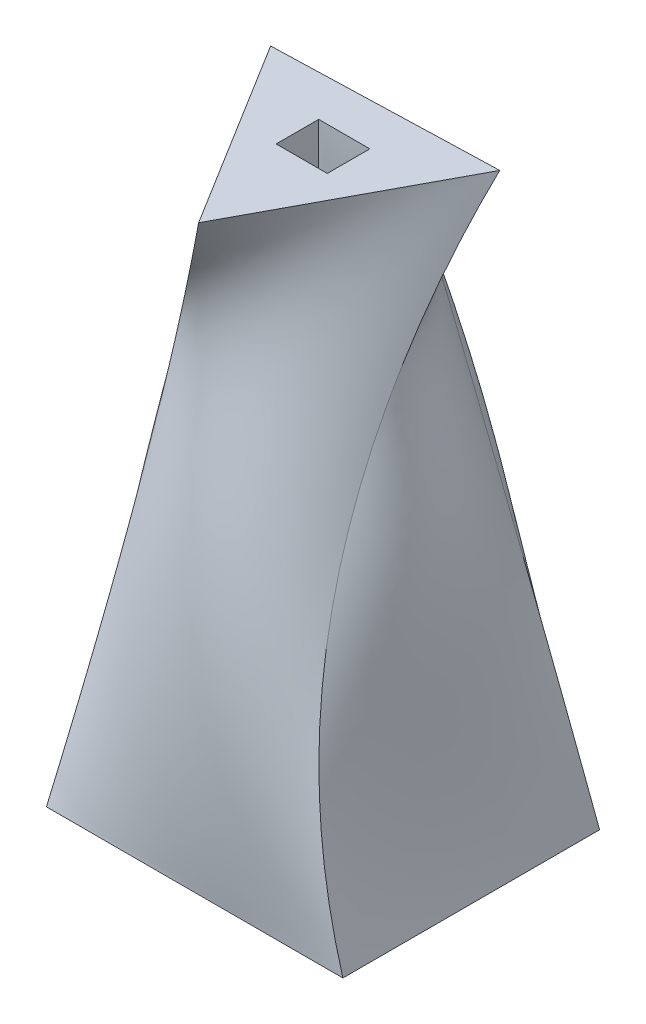
ISO-10303-21;
HEADER;
FILE_DESCRIPTION(('STEP AP214'),'2;1');
FILE_NAME('part.step','',(''),(''),'','','');
FILE_SCHEMA(('AUTOMOTIVE_DESIGN { 1 0 10303 214 1 1 1 1 }'));
ENDSEC;
DATA;
#1=APPLICATION_CONTEXT('core data for automotive mechanical design processes');
#2=APPLICATION_PROTOCOL_DEFINITION('international standard','automotive_design',2000,#1);
#3=PRODUCT_CONTEXT('',#1,'mechanical');
#4=PRODUCT('Part','Part','',(#3));
#5=PRODUCT_RELATED_PRODUCT_CATEGORY('part','',(#4));
#6=PRODUCT_DEFINITION_FORMATION('','',#4);
#7=PRODUCT_DEFINITION_CONTEXT('part definition',#1,'design');
#8=PRODUCT_DEFINITION('design','',#6,#7);
#9=PRODUCT_DEFINITION_SHAPE('','',#8);
#10=(LENGTH_UNIT() NAMED_UNIT(*) SI_UNIT(.MILLI.,.METRE.));
#11=(NAMED_UNIT(*) PLANE_ANGLE_UNIT() SI_UNIT($,.RADIAN.));
#12=(NAMED_UNIT(*) SI_UNIT($,.STERADIAN.) SOLID_ANGLE_UNIT());
#13=UNCERTAINTY_MEASURE_WITH_UNIT(LENGTH_MEASURE(1.E-05),#10,'distance_accuracy_value','');
#14=(GEOMETRIC_REPRESENTATION_CONTEXT(3) GLOBAL_UNCERTAINTY_ASSIGNED_CONTEXT((#13)) GLOBAL_UNIT_ASSIGNED_CONTEXT((#10,
#11,#12)) REPRESENTATION_CONTEXT('',''));
#15=CARTESIAN_POINT('',(0.,0.,0.));
#16=DIRECTION('',(0.,0.,1.));
#17=DIRECTION('',(1.,0.,0.));
#18=AXIS2_PLACEMENT_3D('',#15,#16,#17);
#19=CARTESIAN_POINT('',(0.,200.,0.));
#20=DIRECTION('',(0.,1.,0.));
#21=DIRECTION('',(0.,0.,1.));
#22=AXIS2_PLACEMENT_3D('',#19,#20,#21);
#23=PLANE('',#22);
#24=DIRECTION('',(0.,0.,1.));
#25=VECTOR('',#24,1.);
#26=CARTESIAN_POINT('',(-8.77945840094851,200.,-7.31956122791268));
#27=LINE('',#26,#25);
#28=CARTESIAN_POINT('',(-8.77945840094851,200.,-7.31956122791268));
#29=VERTEX_POINT('',#28);
#30=CARTESIAN_POINT('',(-8.77945840094851,200.,7.31956122791268));
#31=VERTEX_POINT('',#30);
#32=EDGE_CURVE('E330',#29,#31,#27,.T.);
#33=ORIENTED_EDGE('',*,*,#32,.F.);
#34=DIRECTION('',(-1.,0.,0.));
#35=VECTOR('',#34,1.);
#36=CARTESIAN_POINT('',(-8.77945840094851,200.,-7.31956122791268));
#37=LINE('',#36,#35);
#38=CARTESIAN_POINT('',(8.77945840094851,200.,-7.31956122791268));
#39=VERTEX_POINT('',#38);
#40=EDGE_CURVE('E349',#39,#29,#37,.T.);
#41=ORIENTED_EDGE('',*,*,#40,.F.);
#42=DIRECTION('',(0.,0.,-1.));
#43=VECTOR('',#42,1.);
#44=CARTESIAN_POINT('',(8.77945840094851,200.,-7.31956122791268));
#45=LINE('',#44,#43);
#46=CARTESIAN_POINT('',(8.77945840094851,200.,7.31956122791268));
#47=VERTEX_POINT('',#46);
#48=EDGE_CURVE('E310',#47,#39,#45,.T.);
#49=ORIENTED_EDGE('',*,*,#48,.F.);
#50=DIRECTION('',(1.,0.,0.));
#51=VECTOR('',#50,1.);
#52=CARTESIAN_POINT('',(-8.77945840094851,200.,7.31956122791268));
#53=LINE('',#52,#51);
#54=EDGE_CURVE('E145',#31,#47,#53,.T.);
#55=ORIENTED_EDGE('',*,*,#54,.F.);
#56=EDGE_LOOP('',(#33,#41,#49,#55));
#57=FACE_BOUND('',#56,.T.);
#58=DIRECTION('',(0.5263558856183,0.,0.850264359875783));
#59=VECTOR('',#58,1.);
#60=CARTESIAN_POINT('',(-38.88052542294,200.,-20.8828953071879));
#61=LINE('',#60,#59);
#62=CARTESIAN_POINT('',(-38.88052542294,200.,-20.8828953071879));
#63=VERTEX_POINT('',#62);
#64=CARTESIAN_POINT('',(1.35514487087436,200.,44.1129703823469));
#65=VERTEX_POINT('',#64);
#66=EDGE_CURVE('E531',#63,#65,#61,.T.);
#67=ORIENTED_EDGE('',*,*,#66,.T.);
#68=DIRECTION('',(0.47317259277579,0.,-0.880969748314796));
#69=VECTOR('',#68,1.);
#70=CARTESIAN_POINT('',(1.35514487087436,200.,44.1129703823469));
#71=LINE('',#70,#69);
#72=CARTESIAN_POINT('',(37.5253805520656,200.,-23.2300750751588));
#73=VERTEX_POINT('',#72);
#74=EDGE_CURVE('E544',#65,#73,#71,.T.);
#75=ORIENTED_EDGE('',*,*,#74,.T.);
#76=DIRECTION('',(-0.999528478394092,0.,0.030705388439015));
#77=VECTOR('',#76,1.);
#78=CARTESIAN_POINT('',(37.5253805520656,200.,-23.2300750751588));
#79=LINE('',#78,#77);
#80=CARTESIAN_POINT('',(2.06904509961198,200.,-22.1408609344664));
#81=VERTEX_POINT('',#80);
#82=EDGE_CURVE('E12',#73,#81,#79,.T.);
#83=ORIENTED_EDGE('',*,*,#82,.T.);
#84=EDGE_CURVE('E152',#81,#63,#79,.T.);
#85=ORIENTED_EDGE('',*,*,#84,.T.);
#86=EDGE_LOOP('',(#67,#75,#83,#85));
#87=FACE_BOUND('',#86,.T.);
#88=ADVANCED_FACE('F141',(#57,#87),#23,.T.);
#89=CARTESIAN_POINT('',(0.,0.,0.));
#90=DIRECTION('',(0.,1.,0.));
#91=DIRECTION('',(0.,0.,1.));
#92=AXIS2_PLACEMENT_3D('',#89,#90,#91);
#93=PLANE('',#92);
#94=CARTESIAN_POINT('',(0.,0.,0.));
#95=DIRECTION('',(0.,-1.,0.));
#96=DIRECTION('',(0.,0.,-1.));
#97=AXIS2_PLACEMENT_3D('',#94,#95,#96);
#98=CIRCLE('',#97,21.9489551883101);
#99=CARTESIAN_POINT('',(-16.8584942504055,0.,-14.0551700618486));
#100=VERTEX_POINT('',#99);
#101=CARTESIAN_POINT('',(16.8584942504055,0.,-14.0551700618486));
#102=VERTEX_POINT('',#101);
#103=EDGE_CURVE('E226',#100,#102,#98,.T.);
#104=ORIENTED_EDGE('',*,*,#103,.F.);
#105=CARTESIAN_POINT('',(-16.8584942504055,0.,14.0551700618487));
#106=VERTEX_POINT('',#105);
#107=EDGE_CURVE('E234',#106,#100,#98,.T.);
#108=ORIENTED_EDGE('',*,*,#107,.F.);
#109=CARTESIAN_POINT('',(16.8584942504055,0.,14.0551700618486));
#110=VERTEX_POINT('',#109);
#111=EDGE_CURVE('E209',#110,#106,#98,.T.);
#112=ORIENTED_EDGE('',*,*,#111,.F.);
#113=EDGE_CURVE('E219',#102,#110,#98,.T.);
#114=ORIENTED_EDGE('',*,*,#113,.F.);
#115=EDGE_LOOP('',(#104,#108,#112,#114));
#116=FACE_BOUND('',#115,.T.);
#117=DIRECTION('',(0.,0.,-1.));
#118=VECTOR('',#117,1.);
#119=CARTESIAN_POINT('',(50.9473742444007,0.,-44.1129703823469));
#120=LINE('',#119,#118);
#121=CARTESIAN_POINT('',(50.9473742444006,0.,44.1129703823469));
#122=VERTEX_POINT('',#121);
#123=CARTESIAN_POINT('',(50.9473742444007,0.,-44.1129703823469));
#124=VERTEX_POINT('',#123);
#125=EDGE_CURVE('E476',#122,#124,#120,.T.);
#126=ORIENTED_EDGE('',*,*,#125,.F.);
#127=DIRECTION('',(1.,0.,0.));
#128=VECTOR('',#127,1.);
#129=CARTESIAN_POINT('',(-50.9473742444007,0.,44.1129703823469));
#130=LINE('',#129,#128);
#131=CARTESIAN_POINT('',(-50.9473742444007,0.,44.1129703823469));
#132=VERTEX_POINT('',#131);
#133=EDGE_CURVE('E611',#132,#122,#130,.T.);
#134=ORIENTED_EDGE('',*,*,#133,.F.);
#135=DIRECTION('',(0.,0.,1.));
#136=VECTOR('',#135,1.);
#137=CARTESIAN_POINT('',(-50.9473742444007,0.,-44.1129703823469));
#138=LINE('',#137,#136);
#139=CARTESIAN_POINT('',(-50.9473742444007,0.,-44.1129703823469));
#140=VERTEX_POINT('',#139);
#141=EDGE_CURVE('E630',#140,#132,#138,.T.);
#142=ORIENTED_EDGE('',*,*,#141,.F.);
#143=DIRECTION('',(-1.,0.,0.));
#144=VECTOR('',#143,1.);
#145=CARTESIAN_POINT('',(-50.9473742444007,0.,-44.1129703823469));
#146=LINE('',#145,#144);
#147=EDGE_CURVE('E487',#124,#140,#146,.T.);
#148=ORIENTED_EDGE('',*,*,#147,.F.);
#149=EDGE_LOOP('',(#126,#134,#142,#148));
#150=FACE_BOUND('',#149,.T.);
#151=ADVANCED_FACE('F232',(#116,#150),#93,.F.);
#152=CARTESIAN_POINT('',(-50.9473742444007,0.,44.1129703823469));
#153=CARTESIAN_POINT('',(-47.7497858694824,34.0311800146357,33.954620101854));
#154=CARTESIAN_POINT('',(-35.653985154643,102.097888003664,23.7918036298269));
#155=CARTESIAN_POINT('',(-12.8814397926324,167.364513347969,33.954620101854));
#156=CARTESIAN_POINT('',(1.35514487087436,200.,44.1129703823469));
#157=CARTESIAN_POINT('',(-48.8245669842173,0.,44.1129703823469));
#158=CARTESIAN_POINT('',(-46.1012875080215,34.0165957348081,34.9653980509975));
#159=CARTESIAN_POINT('',(-34.7707013697653,102.112485107658,25.6488102372118));
#160=CARTESIAN_POINT('',(-12.1457818868328,167.349929068142,34.0300779751989));
#161=CARTESIAN_POINT('',(2.10869144756584,200.,42.7099902686489));
#162=CARTESIAN_POINT('',(-44.5789524638506,0.,44.1129703823469));
#163=CARTESIAN_POINT('',(-42.8042907850997,33.9874271751531,36.9869539492846));
#164=CARTESIAN_POINT('',(-32.7664836434942,102.141679315645,29.1054480742164));
#165=CARTESIAN_POINT('',(-10.6744660752335,167.320760508487,34.1809937218885));
#166=CARTESIAN_POINT('',(3.61578460094881,200.,39.9040300412528));
#167=CARTESIAN_POINT('',(-38.2105306833005,0.,44.1129703823469));
#168=CARTESIAN_POINT('',(-37.5724063122632,33.9833715488231,39.6827222631516));
#169=CARTESIAN_POINT('',(-29.4119248396814,102.145738508146,33.8214747307241));
#170=CARTESIAN_POINT('',(-8.1811029693807,167.316704882156,34.0708018083595));
#171=CARTESIAN_POINT('',(5.87642433102327,200.,35.6950897001587));
#172=CARTESIAN_POINT('',(-31.8421089027504,0.,44.1129703823469));
#173=CARTESIAN_POINT('',(-32.16252086817,34.0098490425374,42.1150911569667));
#174=CARTESIAN_POINT('',(-25.6682718157645,102.119237732391,37.9610855353401));
#175=CARTESIAN_POINT('',(-5.50973889227125,167.343182375871,33.6972104747785));
#176=CARTESIAN_POINT('',(8.13706406109772,200.,31.4861493590646));
#177=CARTESIAN_POINT('',(-25.4736871222003,0.,44.1129703823469));
#178=CARTESIAN_POINT('',(-26.5829505965687,34.0690760906839,44.2477385690757));
#179=CARTESIAN_POINT('',(-21.6134260650466,102.059958605052,41.5274158753824));
#180=CARTESIAN_POINT('',(-2.66868998765371,167.402409424017,33.0238976594914));
#181=CARTESIAN_POINT('',(10.3977037911722,200.,27.2772090179705));
#182=CARTESIAN_POINT('',(-19.1052653416503,0.,44.1129703823469));
#183=CARTESIAN_POINT('',(-20.8594536909144,34.1572055651462,46.0734915547443));
#184=CARTESIAN_POINT('',(-17.2733242252148,101.97175163708,44.4926075533293));
#185=CARTESIAN_POINT('',(0.316285551016888,167.490538898479,32.0436904177638));
#186=CARTESIAN_POINT('',(12.6583435212466,200.,23.0682686768764));
#187=CARTESIAN_POINT('',(-10.6140363009168,0.,44.1129703823469));
#188=CARTESIAN_POINT('',(-13.0889407555405,34.3088647009426,48.0801762688893));
#189=CARTESIAN_POINT('',(-11.2090215286343,101.81995914523,47.6199200459977));
#190=CARTESIAN_POINT('',(4.43543666374575,167.642198034276,30.3090948287142));
#191=CARTESIAN_POINT('',(15.6725298280126,200.,17.4563482220842));
#192=CARTESIAN_POINT('',(0.,0.,44.1129703823469));
#193=CARTESIAN_POINT('',(-3.11802695992264,34.5444573218582,49.7575260060719));
#194=CARTESIAN_POINT('',(-3.0927977278215,101.584159364345,49.9234442674749));
#195=CARTESIAN_POINT('',(9.84214818105737,167.877790655192,27.3098441869033));
#196=CARTESIAN_POINT('',(19.44026271147,200.,10.441447653594));
#197=CARTESIAN_POINT('',(10.6140363009168,0.,44.1129703823469));
#198=CARTESIAN_POINT('',(6.83290876416987,34.7939209346204,50.2516153087776));
#199=CARTESIAN_POINT('',(5.041800282753,101.334476394651,49.9312070512669));
#200=CARTESIAN_POINT('',(15.2288816268436,168.127254267954,23.1273331106156));
#201=CARTESIAN_POINT('',(23.2079955949274,200.,3.42654708510385));
#202=CARTESIAN_POINT('',(19.1052653416502,0.,44.1129703823469));
#203=CARTESIAN_POINT('',(14.5697214247674,34.9630157054875,49.9919582634593));
#204=CARTESIAN_POINT('',(11.1407728999084,101.165232936327,48.6429029360437));
#205=CARTESIAN_POINT('',(19.3143324647961,168.296349038821,19.1263957621025));
#206=CARTESIAN_POINT('',(26.2221819016933,200.,-2.18537336968829));
#207=CARTESIAN_POINT('',(25.4736871222003,0.,44.1129703823469));
#208=CARTESIAN_POINT('',(20.261913898568,35.0625895742127,49.4849542875092));
#209=CARTESIAN_POINT('',(15.5120146737844,101.065571510871,47.04850389562));
#210=CARTESIAN_POINT('',(22.2680035716129,168.395922907546,15.8134315587563));
#211=CARTESIAN_POINT('',(28.4828216317678,200.,-6.3943137107824));
#212=CARTESIAN_POINT('',(31.8421089027504,0.,44.1129703823469));
#213=CARTESIAN_POINT('',(25.8083516762792,35.1248051279284,48.6825424192191));
#214=CARTESIAN_POINT('',(19.6001000546184,101.003301250127,44.8415227826913));
#215=CARTESIAN_POINT('',(25.0759199823405,168.458138461262,12.2050594630702));
#216=CARTESIAN_POINT('',(30.7434613618422,200.,-10.6032540518765));
#217=CARTESIAN_POINT('',(38.2105306833005,0.,44.1129703823469));
#218=CARTESIAN_POINT('',(31.1887774870495,35.1370698263471,47.5964333899944));
#219=CARTESIAN_POINT('',(23.3731996175968,100.991025767182,42.0451855832556));
#220=CARTESIAN_POINT('',(27.717824426127,168.47040315968,8.31299020644947));
#221=CARTESIAN_POINT('',(33.0041010919167,200.,-14.8121943929706));
#222=CARTESIAN_POINT('',(44.5789524638505,0.,44.1129703823469));
#223=CARTESIAN_POINT('',(36.3985718644675,35.0962032344977,46.2644727979159));
#224=CARTESIAN_POINT('',(26.7498889242191,101.031928293613,38.6548905092785));
#225=CARTESIAN_POINT('',(30.1890974365612,168.429536567831,4.17506938697479));
#226=CARTESIAN_POINT('',(35.2647408219911,200.,-19.0211347340647));
#227=CARTESIAN_POINT('',(48.8245669842173,0.,44.1129703823469));
#228=CARTESIAN_POINT('',(39.6945947057715,35.009596389461,45.173903357476));
#229=CARTESIAN_POINT('',(28.7550739181356,101.11861129329,36.0602654705799));
#230=CARTESIAN_POINT('',(31.6594393665427,168.342929722794,1.2138597949376));
#231=CARTESIAN_POINT('',(36.7718339753741,200.,-21.8270949614608));
#232=CARTESIAN_POINT('',(50.9473742444006,0.,44.1129703823469));
#233=CARTESIAN_POINT('',(41.3426061264235,34.9662929669427,44.6286186372562));
#234=CARTESIAN_POINT('',(29.6388450719963,101.161952793129,34.6342666248327));
#235=CARTESIAN_POINT('',(32.3946103315334,168.299626300276,-0.266745001080987));
#236=CARTESIAN_POINT('',(37.5253805520656,200.,-23.2300750751588));
#237=B_SPLINE_SURFACE_WITH_KNOTS('',3,3,((#152,#153,#154,#155,#156),(#157,#158,#159,#160,#161),
(#162,#163,#164,#165,#166),(#167,#168,#169,#170,#171),(#172,#173,#174,#175,#176),(#177,#178,
#179,#180,#181),(#182,#183,#184,#185,#186),(#187,#188,#189,#190,#191),(#192,#193,#194,#195,
#196),(#197,#198,#199,#200,#201),(#202,#203,#204,#205,#206),(#207,#208,#209,#210,#211),(#212,
#213,#214,#215,#216),(#217,#218,#219,#220,#221),(#222,#223,#224,#225,#226),(#227,#228,#229,#230,
#231),(#232,#233,#234,#235,#236)),.UNSPECIFIED.,.F.,.F.,.F.,(4,1,1,1,1,1,1,1,1,1,1,1,1,1,4),(4,
1,4),(0.,0.0625,0.125,0.1875,0.25,0.3125,0.375,0.5,0.625,0.6875,0.75,0.8125,0.875,0.9375,1.),
(0.,0.489518302185247,1.),.UNSPECIFIED.);
#238=CARTESIAN_POINT('',(50.9473742444006,0.,44.1129703823469));
#239=CARTESIAN_POINT('',(41.3426061264235,34.9662929669427,44.6286186372562));
#240=CARTESIAN_POINT('',(29.6388450719963,101.161952793129,34.6342666248327));
#241=CARTESIAN_POINT('',(32.3946103315334,168.299626300276,-0.266745001080987));
#242=CARTESIAN_POINT('',(37.5253805520656,200.,-23.2300750751588));
#243=B_SPLINE_CURVE_WITH_KNOTS('',3,(#238,#239,#240,#241,#242),.UNSPECIFIED.,.F.,.F.,(4,1,4),
(0.,0.489518302185247,1.),.UNSPECIFIED.);
#244=EDGE_CURVE('E594',#122,#73,#243,.T.);
#245=CARTESIAN_POINT('',(-50.9473742444007,0.,44.1129703823469));
#246=CARTESIAN_POINT('',(-47.7497858694824,34.0311800146357,33.954620101854));
#247=CARTESIAN_POINT('',(-35.653985154643,102.097888003664,23.7918036298269));
#248=CARTESIAN_POINT('',(-12.8814397926324,167.364513347969,33.954620101854));
#249=CARTESIAN_POINT('',(1.35514487087436,200.,44.1129703823469));
#250=B_SPLINE_CURVE_WITH_KNOTS('',3,(#245,#246,#247,#248,#249),.UNSPECIFIED.,.F.,.F.,(4,1,4),
(0.,0.489518302185247,1.),.UNSPECIFIED.);
#251=EDGE_CURVE('E600',#65,#132,#250,.F.);
#252=ORIENTED_EDGE('',*,*,#133,.T.);
#253=ORIENTED_EDGE('',*,*,#244,.T.);
#254=ORIENTED_EDGE('',*,*,#74,.F.);
#255=ORIENTED_EDGE('',*,*,#251,.T.);
#256=EDGE_LOOP('',(#252,#253,#254,#255));
#257=FACE_BOUND('',#256,.T.);
#258=ADVANCED_FACE('F257',(#257),#237,.T.);
#259=CARTESIAN_POINT('',(50.9473742444007,0.,44.1129703823469));
#260=CARTESIAN_POINT('',(41.3426061264235,34.9662929669427,44.6286186372561));
#261=CARTESIAN_POINT('',(29.6388450719963,101.161952793129,34.6342666248327));
#262=CARTESIAN_POINT('',(32.3946103315334,168.299626300276,-0.266745001081001));
#263=CARTESIAN_POINT('',(37.5253805520656,200.,-23.2300750751588));
#264=CARTESIAN_POINT('',(50.9473742444007,0.,14.7043234607823));
#265=CARTESIAN_POINT('',(43.3184077620909,34.546871254492,17.2272543579171));
#266=CARTESIAN_POINT('',(60.1420899696403,101.581743309105,19.3934397952167));
#267=CARTESIAN_POINT('',(26.4912263111,167.880204587825,-7.82029707922311));
#268=CARTESIAN_POINT('',(25.7066020679144,200.,-22.867003694928));
#269=CARTESIAN_POINT('',(50.9473742444007,0.,-14.7043234607823));
#270=CARTESIAN_POINT('',(45.2942093977583,34.1274495420414,-10.1741099214219));
#271=CARTESIAN_POINT('',(61.9423608454844,102.001533825082,-11.950207089523));
#272=CARTESIAN_POINT('',(20.5878422906667,167.460782875375,-15.3738491573652));
#273=CARTESIAN_POINT('',(13.8878235837632,200.,-22.5039323146972));
#274=CARTESIAN_POINT('',(50.9473742444007,0.,-44.1129703823469));
#275=CARTESIAN_POINT('',(47.2700110334257,33.7080278295908,-37.575474200761));
#276=CARTESIAN_POINT('',(35.0396576995287,102.421324341059,-27.191033919139));
#277=CARTESIAN_POINT('',(14.6844582702333,167.041361162924,-22.9274012355073));
#278=CARTESIAN_POINT('',(2.06904509961199,200.,-22.1408609344664));
#279=B_SPLINE_SURFACE_WITH_KNOTS('',3,3,((#259,#260,#261,#262,#263),(#264,#265,#266,#267,#268),
(#269,#270,#271,#272,#273),(#274,#275,#276,#277,#278)),.UNSPECIFIED.,.F.,.F.,.F.,(4,4),(4,1,4),
(0.,1.),(0.,0.489518302185247,1.),.UNSPECIFIED.);
#280=CARTESIAN_POINT('',(50.9473742444007,0.,-44.1129703823469));
#281=CARTESIAN_POINT('',(47.2700110334257,33.7080278295908,-37.575474200761));
#282=CARTESIAN_POINT('',(35.0396576995287,102.421324341059,-27.191033919139));
#283=CARTESIAN_POINT('',(14.6844582702333,167.041361162924,-22.9274012355073));
#284=CARTESIAN_POINT('',(2.06904509961199,200.,-22.1408609344664));
#285=B_SPLINE_CURVE_WITH_KNOTS('',3,(#280,#281,#282,#283,#284),.UNSPECIFIED.,.F.,.F.,(4,1,4),
(0.,0.489518302185247,1.),.UNSPECIFIED.);
#286=EDGE_CURVE('E492',#124,#81,#285,.T.);
#287=ORIENTED_EDGE('',*,*,#125,.T.);
#288=ORIENTED_EDGE('',*,*,#286,.T.);
#289=ORIENTED_EDGE('',*,*,#82,.F.);
#290=ORIENTED_EDGE('',*,*,#244,.F.);
#291=EDGE_LOOP('',(#287,#288,#289,#290));
#292=FACE_BOUND('',#291,.T.);
#293=ADVANCED_FACE('F563',(#292),#279,.T.);
#294=CARTESIAN_POINT('',(-50.9473742444007,0.,-44.1129703823469));
#295=CARTESIAN_POINT('',(-41.2484524542827,32.966776377912,-37.868875009016));
#296=CARTESIAN_POINT('',(-29.2999166637717,103.163227585768,-27.2994771605547));
#297=CARTESIAN_POINT('',(-33.203886573309,166.300109711245,-22.3821582922433));
#298=CARTESIAN_POINT('',(-38.88052542294,200.,-20.8828953071879));
#299=CARTESIAN_POINT('',(-50.9473742444007,0.,-14.7043234607823));
#300=CARTESIAN_POINT('',(-43.4155635926826,33.3215775901532,-13.9277099720593));
#301=CARTESIAN_POINT('',(-60.120913515862,102.808114391733,-15.6366569154687));
#302=CARTESIAN_POINT('',(-26.4297376464168,166.654910923487,-3.60323216087753));
#303=CARTESIAN_POINT('',(-25.4686353250019,200.,0.782393255990379));
#304=CARTESIAN_POINT('',(-50.9473742444007,0.,14.7043234607823));
#305=CARTESIAN_POINT('',(-45.5826747310825,33.6763788023944,10.0134550648973));
#306=CARTESIAN_POINT('',(-62.2389363461525,102.453001197699,12.128983384741));
#307=CARTESIAN_POINT('',(-19.6555887195246,167.009712135728,15.1756939704882));
#308=CARTESIAN_POINT('',(-12.0567452270638,200.,22.4476818191686));
#309=CARTESIAN_POINT('',(-50.9473742444007,0.,44.1129703823469));
#310=CARTESIAN_POINT('',(-47.7497858694824,34.0311800146357,33.954620101854));
#311=CARTESIAN_POINT('',(-35.653985154643,102.097888003664,23.7918036298269));
#312=CARTESIAN_POINT('',(-12.8814397926324,167.364513347969,33.954620101854));
#313=CARTESIAN_POINT('',(1.35514487087437,200.,44.1129703823469));
#314=B_SPLINE_SURFACE_WITH_KNOTS('',3,3,((#294,#295,#296,#297,#298),(#299,#300,#301,#302,#303),
(#304,#305,#306,#307,#308),(#309,#310,#311,#312,#313)),.UNSPECIFIED.,.F.,.F.,.F.,(4,4),(4,1,4),
(0.,1.),(0.,0.489518302185247,1.),.UNSPECIFIED.);
#315=CARTESIAN_POINT('',(-50.9473742444007,0.,-44.1129703823469));
#316=CARTESIAN_POINT('',(-41.2484524542827,32.966776377912,-37.868875009016));
#317=CARTESIAN_POINT('',(-29.2999166637718,103.163227585768,-27.2994771605547));
#318=CARTESIAN_POINT('',(-33.203886573309,166.300109711245,-22.3821582922433));
#319=CARTESIAN_POINT('',(-38.88052542294,200.,-20.8828953071879));
#320=B_SPLINE_CURVE_WITH_KNOTS('',3,(#315,#316,#317,#318,#319),.UNSPECIFIED.,.F.,.F.,(4,1,4),
(0.,0.489518302185247,1.),.UNSPECIFIED.);
#321=EDGE_CURVE('E635',#140,#63,#320,.T.);
#322=ORIENTED_EDGE('',*,*,#141,.T.);
#323=ORIENTED_EDGE('',*,*,#251,.F.);
#324=ORIENTED_EDGE('',*,*,#66,.F.);
#325=ORIENTED_EDGE('',*,*,#321,.F.);
#326=EDGE_LOOP('',(#322,#323,#324,#325));
#327=FACE_BOUND('',#326,.T.);
#328=ADVANCED_FACE('F504',(#327),#314,.T.);
#329=CARTESIAN_POINT('',(50.9473742444006,0.,-44.1129703823469));
#330=CARTESIAN_POINT('',(47.2700110334257,33.7080278295908,-37.575474200761));
#331=CARTESIAN_POINT('',(35.0396576995287,102.421324341059,-27.191033919139));
#332=CARTESIAN_POINT('',(14.6844582702333,167.041361162924,-22.9274012355073));
#333=CARTESIAN_POINT('',(2.06904509961199,200.,-22.1408609344664));
#334=CARTESIAN_POINT('',(48.8245669842173,0.,-44.1129703823469));
#335=CARTESIAN_POINT('',(45.6186966156197,33.7656862188661,-38.3550743100711));
#336=CARTESIAN_POINT('',(34.1910193020928,102.363615251935,-28.8393436174891));
#337=CARTESIAN_POINT('',(13.879604657514,167.0990195522,-23.6895295999942));
#338=CARTESIAN_POINT('',(1.21592904705882,200.,-22.1146533172315));
#339=CARTESIAN_POINT('',(44.5789524638505,0.,-44.1129703823469));
#340=CARTESIAN_POINT('',(42.3160677800076,33.8810029974168,-39.9142745286914));
#341=CARTESIAN_POINT('',(32.2560923507054,102.248197073687,-31.8785876364241));
#342=CARTESIAN_POINT('',(12.2698974320756,167.21433633075,-25.2137863289678));
#343=CARTESIAN_POINT('',(-0.490303058047512,200.,-22.0622380827615));
#344=CARTESIAN_POINT('',(38.2105306833005,0.,-44.1129703823469));
#345=CARTESIAN_POINT('',(37.1077555589826,33.9946319497835,-41.9220521028603));
#346=CARTESIAN_POINT('',(28.973421132356,102.134468205753,-35.9629759121797));
#347=CARTESIAN_POINT('',(9.60096762631093,167.327965283117,-27.1691486686668));
#348=CARTESIAN_POINT('',(-3.04965121570702,200.,-21.9836152310566));
#349=CARTESIAN_POINT('',(31.8421089027504,0.,-44.1129703823469));
#350=CARTESIAN_POINT('',(31.73790317223,34.0723342116519,-43.6723209468728));
#351=CARTESIAN_POINT('',(25.2851804141512,102.056697619172,-39.4650524663797));
#352=CARTESIAN_POINT('',(6.77049765481873,167.405667544985,-28.8670022782093));
#353=CARTESIAN_POINT('',(-5.60899937336652,200.,-21.9049923793517));
#354=CARTESIAN_POINT('',(25.4736871222003,0.,-44.1129703823469));
#355=CARTESIAN_POINT('',(26.2122003911845,34.1150984122839,-45.1305095076346));
#356=CARTESIAN_POINT('',(21.2719003711145,102.013895815365,-42.3862006385352));
#357=CARTESIAN_POINT('',(3.78417728903365,167.448431745617,-30.2727756045012));
#358=CARTESIAN_POINT('',(-8.16834753102602,200.,-21.8263695276468));
#359=CARTESIAN_POINT('',(19.1052653416502,0.,-44.1129703823469));
#360=CARTESIAN_POINT('',(20.5506154540818,34.1283922838555,-46.29065153634));
#361=CARTESIAN_POINT('',(16.9653126873432,102.000590254302,-44.6973544741313));
#362=CARTESIAN_POINT('',(0.661974767191319,167.461725617189,-31.3805023987366));
#363=CARTESIAN_POINT('',(-10.7276956886855,200.,-21.7477466759419));
#364=CARTESIAN_POINT('',(10.6140363009168,0.,-44.1129703823469));
#365=CARTESIAN_POINT('',(12.8675343919162,34.1129866272041,-47.4228286931857));
#366=CARTESIAN_POINT('',(10.9408086570466,102.016009457368,-46.9396313837032));
#367=CARTESIAN_POINT('',(-3.63526307462711,167.446319960537,-32.4427925762892));
#368=CARTESIAN_POINT('',(-14.1401598988982,200.,-21.642916207002));
#369=CARTESIAN_POINT('',(0.,0.,-44.1129703823469));
#370=CARTESIAN_POINT('',(3.0043259326391,34.0370021664358,-48.0325452217031));
#371=CARTESIAN_POINT('',(2.87591908753632,102.092060732362,-48.1113374647465));
#372=CARTESIAN_POINT('',(-9.26616750847025,167.370335499769,-32.9651503806899));
#373=CARTESIAN_POINT('',(-18.405740161664,200.,-21.5118781208271));
#374=CARTESIAN_POINT('',(-10.6140363009168,0.,-44.1129703823469));
#375=CARTESIAN_POINT('',(-6.86154611836655,33.9090613462014,-47.48867077156));
#376=CARTESIAN_POINT('',(-5.18468311934262,102.220114052794,-46.9575865635105));
#377=CARTESIAN_POINT('',(-14.8997355340419,167.242394679535,-32.3339172064303));
#378=CARTESIAN_POINT('',(-22.6713204244299,200.,-21.3808400346523));
#379=CARTESIAN_POINT('',(-19.1052653416503,0.,-44.1129703823469));
#380=CARTESIAN_POINT('',(-14.5488715983722,33.7784237493123,-46.4073510534148));
#381=CARTESIAN_POINT('',(-11.2058790122855,102.350866521196,-44.7313555134536));
#382=CARTESIAN_POINT('',(-19.2012177937004,167.111757082646,-31.1827105089918));
#383=CARTESIAN_POINT('',(-26.0837846346425,200.,-21.2760095657124));
#384=CARTESIAN_POINT('',(-25.4736871222003,0.,-44.1129703823469));
#385=CARTESIAN_POINT('',(-20.2130534540313,33.6634277154581,-45.2846085411524));
#386=CARTESIAN_POINT('',(-15.5096754697473,102.465963672711,-42.4330023564934));
#387=CARTESIAN_POINT('',(-22.3260172340991,166.996761048791,-30.0075527622594));
#388=CARTESIAN_POINT('',(-28.643132792302,200.,-21.1973867140075));
#389=CARTESIAN_POINT('',(-31.8421089027504,0.,-44.1129703823469));
#390=CARTESIAN_POINT('',(-25.7398730244511,33.5294552272353,-43.8628440612694));
#391=CARTESIAN_POINT('',(-19.5219157437497,102.600053964864,-39.5256843802169));
#392=CARTESIAN_POINT('',(-25.3134543892585,166.862788560569,-28.5333730479066));
#393=CARTESIAN_POINT('',(-31.2024809499615,200.,-21.1187638623026));
#394=CARTESIAN_POINT('',(-38.2105306833005,0.,-44.1129703823469));
#395=CARTESIAN_POINT('',(-31.1076160102617,33.3720565218817,-42.1479695427736));
#396=CARTESIAN_POINT('',(-23.2122287191836,102.757591073156,-36.0384314719901));
#397=CARTESIAN_POINT('',(-28.1418149598088,166.705389855215,-26.7660832949408));
#398=CARTESIAN_POINT('',(-33.761829107621,200.,-21.0401410105977));
#399=CARTESIAN_POINT('',(-44.5789524638506,0.,-44.1129703823469));
#400=CARTESIAN_POINT('',(-36.3096867157742,33.1904415205689,-40.1745914795348));
#401=CARTESIAN_POINT('',(-26.5011679245528,102.939365771144,-31.9698837961799));
#402=CARTESIAN_POINT('',(-30.8045032500609,166.523774853902,-24.740289997232));
#403=CARTESIAN_POINT('',(-36.3211772652805,200.,-20.9615181588928));
#404=CARTESIAN_POINT('',(-48.8245669842173,0.,-44.1129703823469));
#405=CARTESIAN_POINT('',(-39.6021972081132,33.0413314254643,-38.6374471658555));
#406=CARTESIAN_POINT('',(-28.4462146460972,103.088606980893,-28.942070256695));
#407=CARTESIAN_POINT('',(-32.4040921322263,166.374664758798,-23.1682021939062));
#408=CARTESIAN_POINT('',(-38.0274093703869,200.,-20.9091029244229));
#409=CARTESIAN_POINT('',(-50.9473742444007,0.,-44.1129703823469));
#410=CARTESIAN_POINT('',(-41.2484524542827,32.966776377912,-37.868875009016));
#411=CARTESIAN_POINT('',(-29.2999166637718,103.163227585768,-27.2994771605547));
#412=CARTESIAN_POINT('',(-33.203886573309,166.300109711245,-22.3821582922433));
#413=CARTESIAN_POINT('',(-38.88052542294,200.,-20.8828953071879));
#414=B_SPLINE_SURFACE_WITH_KNOTS('',3,3,((#329,#330,#331,#332,#333),(#334,#335,#336,#337,#338),
(#339,#340,#341,#342,#343),(#344,#345,#346,#347,#348),(#349,#350,#351,#352,#353),(#354,#355,
#356,#357,#358),(#359,#360,#361,#362,#363),(#364,#365,#366,#367,#368),(#369,#370,#371,#372,
#373),(#374,#375,#376,#377,#378),(#379,#380,#381,#382,#383),(#384,#385,#386,#387,#388),(#389,
#390,#391,#392,#393),(#394,#395,#396,#397,#398),(#399,#400,#401,#402,#403),(#404,#405,#406,#407,
#408),(#409,#410,#411,#412,#413)),.UNSPECIFIED.,.F.,.F.,.F.,(4,1,1,1,1,1,1,1,1,1,1,1,1,1,4),(4,
1,4),(0.,0.0625,0.125,0.1875,0.25,0.3125,0.375,0.5,0.625,0.6875,0.75,0.8125,0.875,0.9375,1.),
(0.,0.489518302185247,1.),.UNSPECIFIED.);
#415=ORIENTED_EDGE('',*,*,#147,.T.);
#416=ORIENTED_EDGE('',*,*,#321,.T.);
#417=ORIENTED_EDGE('',*,*,#84,.F.);
#418=ORIENTED_EDGE('',*,*,#286,.F.);
#419=EDGE_LOOP('',(#415,#416,#417,#418));
#420=FACE_BOUND('',#419,.T.);
#421=ADVANCED_FACE('F395',(#420),#414,.T.);
#422=CARTESIAN_POINT('',(-16.8584942504055,0.,-14.0551700618486));
#423=CARTESIAN_POINT('',(-8.77945840094851,200.,-7.31956122791268));
#424=CARTESIAN_POINT('',(-17.6085216198658,0.,-13.1555486385536));
#425=CARTESIAN_POINT('',(-8.77945840094851,200.,-6.70959779225329));
#426=CARTESIAN_POINT('',(-18.308284271035,0.,-12.1690499150849));
#427=CARTESIAN_POINT('',(-8.77945840094851,200.,-6.0996343565939));
#428=CARTESIAN_POINT('',(-19.5567932975619,0.,-10.0404623748757));
#429=CARTESIAN_POINT('',(-8.77945840094851,200.,-4.87970748527512));
#430=CARTESIAN_POINT('',(-20.1052557553881,0.,-8.89836988764823));
#431=CARTESIAN_POINT('',(-8.77945840094851,200.,-4.26974404961573));
#432=CARTESIAN_POINT('',(-21.0049770083103,0.,-6.49563211145213));
#433=CARTESIAN_POINT('',(-8.77945840094851,200.,-3.04981717829694));
#434=CARTESIAN_POINT('',(-21.3559564479814,0.,-5.23513995769976));
#435=CARTESIAN_POINT('',(-8.77945840094851,200.,-2.43985374263755));
#436=CARTESIAN_POINT('',(-21.8280333131047,0.,-2.64962787326289));
#437=CARTESIAN_POINT('',(-8.77945840094851,200.,-1.21992687131877));
#438=CARTESIAN_POINT('',(-21.9489551883101,0.,-1.3249015430176));
#439=CARTESIAN_POINT('',(-8.77945840094851,200.,-0.609963435659382));
#440=CARTESIAN_POINT('',(-21.9489551883101,0.,1.32490154301762));
#441=CARTESIAN_POINT('',(-8.77945840094851,200.,0.609963435659398));
#442=CARTESIAN_POINT('',(-21.8280333131047,0.,2.64962787326292));
#443=CARTESIAN_POINT('',(-8.77945840094851,200.,1.21992687131879));
#444=CARTESIAN_POINT('',(-21.3559564479814,0.,5.23513995769979));
#445=CARTESIAN_POINT('',(-8.77945840094851,200.,2.43985374263757));
#446=CARTESIAN_POINT('',(-21.0049770083103,0.,6.49563211145216));
#447=CARTESIAN_POINT('',(-8.77945840094851,200.,3.04981717829696));
#448=CARTESIAN_POINT('',(-20.1052557553881,0.,8.89836988764826));
#449=CARTESIAN_POINT('',(-8.77945840094851,200.,4.26974404961573));
#450=CARTESIAN_POINT('',(-19.5567932975619,0.,10.0404623748757));
#451=CARTESIAN_POINT('',(-8.77945840094851,200.,4.87970748527512));
#452=CARTESIAN_POINT('',(-18.308284271035,0.,12.169049915085));
#453=CARTESIAN_POINT('',(-8.77945840094851,200.,6.0996343565939));
#454=CARTESIAN_POINT('',(-17.6085216198658,0.,13.1555486385537));
#455=CARTESIAN_POINT('',(-8.77945840094851,200.,6.70959779225329));
#456=CARTESIAN_POINT('',(-16.8584942504055,0.,14.0551700618487));
#457=CARTESIAN_POINT('',(-8.77945840094851,200.,7.31956122791268));
#458=B_SPLINE_SURFACE_WITH_KNOTS('',3,1,((#422,#423),(#424,#425),(#426,#427),(#428,#429),(#430,
#431),(#432,#433),(#434,#435),(#436,#437),(#438,#439),(#440,#441),(#442,#443),(#444,#445),(#446,
#447),(#448,#449),(#450,#451),(#452,#453),(#454,#455),(#456,#457)),.UNSPECIFIED.,.F.,.F.,.F.,(4,
2,2,2,2,2,2,2,4),(2,2),(0.,0.125,0.25,0.375,0.5,0.625,0.75,0.875,1.),(0.,1.),.UNSPECIFIED.);
#459=DIRECTION('',(-0.0403394287218536,-0.998619871814649,-0.0336315641516937));
#460=VECTOR('',#459,1.);
#461=CARTESIAN_POINT('',(-12.818976325677,100.,-10.6873656448807));
#462=LINE('',#461,#460);
#463=EDGE_CURVE('E237',#29,#100,#462,.T.);
#464=DIRECTION('',(0.0403394287218535,0.998619871814649,-0.0336315641516938));
#465=VECTOR('',#464,1.);
#466=CARTESIAN_POINT('',(-12.818976325677,100.,10.6873656448807));
#467=LINE('',#466,#465);
#468=EDGE_CURVE('E216',#106,#31,#467,.T.);
#469=ORIENTED_EDGE('',*,*,#107,.T.);
#470=ORIENTED_EDGE('',*,*,#463,.F.);
#471=ORIENTED_EDGE('',*,*,#32,.T.);
#472=ORIENTED_EDGE('',*,*,#468,.F.);
#473=EDGE_LOOP('',(#469,#470,#471,#472));
#474=FACE_BOUND('',#473,.T.);
#475=ADVANCED_FACE('F384',(#474),#458,.F.);
#476=CARTESIAN_POINT('',(-16.8584942504055,0.,14.0551700618487));
#477=CARTESIAN_POINT('',(-8.77945840094851,200.,7.31956122791268));
#478=CARTESIAN_POINT('',(-15.9588728271105,0.,15.1342222914142));
#479=CARTESIAN_POINT('',(-8.04783686753614,200.,7.31956122791268));
#480=CARTESIAN_POINT('',(-14.9135490848559,0.,16.1761495153336));
#481=CARTESIAN_POINT('',(-7.31621533412376,200.,7.31956122791268));
#482=CARTESIAN_POINT('',(-12.5335034214913,0.,18.0829491906685));
#483=CARTESIAN_POINT('',(-5.85297226729901,200.,7.31956122791268));
#484=CARTESIAN_POINT('',(-11.1984018399024,0.,18.9470161108461));
#485=CARTESIAN_POINT('',(-5.12135073388663,200.,7.31956122791268));
#486=CARTESIAN_POINT('',(-8.28816983490573,0.,20.3887190392224));
#487=CARTESIAN_POINT('',(-3.65810766706188,200.,7.31956122791268));
#488=CARTESIAN_POINT('',(-6.71325465466037,0.,20.9653058133571));
#489=CARTESIAN_POINT('',(-2.92648613364951,200.,7.31956122791268));
#490=CARTESIAN_POINT('',(-3.42515122144125,0.,21.7458082171292));
#491=CARTESIAN_POINT('',(-1.46324306682475,200.,7.31956122791268));
#492=CARTESIAN_POINT('',(-1.71288860315111,0.,21.9489551883101));
#493=CARTESIAN_POINT('',(-0.731621533412377,200.,7.31956122791268));
#494=CARTESIAN_POINT('',(1.71288860315112,0.,21.9489551883101));
#495=CARTESIAN_POINT('',(0.731621533412376,200.,7.31956122791268));
#496=CARTESIAN_POINT('',(3.42515122144127,0.,21.7458082171292));
#497=CARTESIAN_POINT('',(1.46324306682475,200.,7.31956122791268));
#498=CARTESIAN_POINT('',(6.71325465466039,0.,20.9653058133571));
#499=CARTESIAN_POINT('',(2.9264861336495,200.,7.31956122791268));
#500=CARTESIAN_POINT('',(8.28816983490575,0.,20.3887190392224));
#501=CARTESIAN_POINT('',(3.65810766706188,200.,7.31956122791268));
#502=CARTESIAN_POINT('',(11.1984018399024,0.,18.9470161108461));
#503=CARTESIAN_POINT('',(5.12135073388663,200.,7.31956122791268));
#504=CARTESIAN_POINT('',(12.5335034214913,0.,18.0829491906685));
#505=CARTESIAN_POINT('',(5.85297226729901,200.,7.31956122791268));
#506=CARTESIAN_POINT('',(14.9135490848559,0.,16.1761495153336));
#507=CARTESIAN_POINT('',(7.31621533412376,200.,7.31956122791268));
#508=CARTESIAN_POINT('',(15.9588728271105,0.,15.1342222914142));
#509=CARTESIAN_POINT('',(8.04783686753614,200.,7.31956122791268));
#510=CARTESIAN_POINT('',(16.8584942504055,0.,14.0551700618486));
#511=CARTESIAN_POINT('',(8.77945840094851,200.,7.31956122791268));
#512=B_SPLINE_SURFACE_WITH_KNOTS('',3,1,((#476,#477),(#478,#479),(#480,#481),(#482,#483),(#484,
#485),(#486,#487),(#488,#489),(#490,#491),(#492,#493),(#494,#495),(#496,#497),(#498,#499),(#500,
#501),(#502,#503),(#504,#505),(#506,#507),(#508,#509),(#510,#511)),.UNSPECIFIED.,.F.,.F.,.F.,(4,
2,2,2,2,2,2,2,4),(2,2),(0.,0.125,0.25,0.375,0.5,0.625,0.75,0.875,1.),(0.,1.),.UNSPECIFIED.);
#513=DIRECTION('',(-0.0403394287218536,0.998619871814649,-0.0336315641516937));
#514=VECTOR('',#513,1.);
#515=CARTESIAN_POINT('',(12.818976325677,100.,10.6873656448807));
#516=LINE('',#515,#514);
#517=EDGE_CURVE('E160',#110,#47,#516,.T.);
#518=ORIENTED_EDGE('',*,*,#111,.T.);
#519=ORIENTED_EDGE('',*,*,#468,.T.);
#520=ORIENTED_EDGE('',*,*,#54,.T.);
#521=ORIENTED_EDGE('',*,*,#517,.F.);
#522=EDGE_LOOP('',(#518,#519,#520,#521));
#523=FACE_BOUND('',#522,.T.);
#524=ADVANCED_FACE('F206',(#523),#512,.F.);
#525=CARTESIAN_POINT('',(16.8584942504055,0.,-14.0551700618486));
#526=CARTESIAN_POINT('',(8.77945840094851,200.,-7.31956122791268));
#527=CARTESIAN_POINT('',(15.9588728271105,0.,-15.1342222914142));
#528=CARTESIAN_POINT('',(8.04783686753614,200.,-7.31956122791268));
#529=CARTESIAN_POINT('',(14.9135490848559,0.,-16.1761495153336));
#530=CARTESIAN_POINT('',(7.31621533412376,200.,-7.31956122791268));
#531=CARTESIAN_POINT('',(12.5335034214913,0.,-18.0829491906685));
#532=CARTESIAN_POINT('',(5.85297226729901,200.,-7.31956122791268));
#533=CARTESIAN_POINT('',(11.1984018399024,0.,-18.9470161108461));
#534=CARTESIAN_POINT('',(5.12135073388663,200.,-7.31956122791268));
#535=CARTESIAN_POINT('',(8.28816983490575,0.,-20.3887190392224));
#536=CARTESIAN_POINT('',(3.65810766706188,200.,-7.31956122791268));
#537=CARTESIAN_POINT('',(6.71325465466038,0.,-20.9653058133571));
#538=CARTESIAN_POINT('',(2.92648613364951,200.,-7.31956122791268));
#539=CARTESIAN_POINT('',(3.42515122144126,0.,-21.7458082171292));
#540=CARTESIAN_POINT('',(1.46324306682475,200.,-7.31956122791268));
#541=CARTESIAN_POINT('',(1.71288860315112,0.,-21.9489551883101));
#542=CARTESIAN_POINT('',(0.731621533412377,200.,-7.31956122791268));
#543=CARTESIAN_POINT('',(-1.71288860315112,0.,-21.9489551883101));
#544=CARTESIAN_POINT('',(-0.731621533412376,200.,-7.31956122791268));
#545=CARTESIAN_POINT('',(-3.42515122144127,0.,-21.7458082171292));
#546=CARTESIAN_POINT('',(-1.46324306682475,200.,-7.31956122791268));
#547=CARTESIAN_POINT('',(-6.71325465466039,0.,-20.9653058133571));
#548=CARTESIAN_POINT('',(-2.9264861336495,200.,-7.31956122791268));
#549=CARTESIAN_POINT('',(-8.28816983490575,0.,-20.3887190392224));
#550=CARTESIAN_POINT('',(-3.65810766706188,200.,-7.31956122791268));
#551=CARTESIAN_POINT('',(-11.1984018399024,0.,-18.9470161108461));
#552=CARTESIAN_POINT('',(-5.12135073388663,200.,-7.31956122791268));
#553=CARTESIAN_POINT('',(-12.5335034214913,0.,-18.0829491906685));
#554=CARTESIAN_POINT('',(-5.85297226729901,200.,-7.31956122791268));
#555=CARTESIAN_POINT('',(-14.9135490848559,0.,-16.1761495153335));
#556=CARTESIAN_POINT('',(-7.31621533412376,200.,-7.31956122791268));
#557=CARTESIAN_POINT('',(-15.9588728271105,0.,-15.1342222914142));
#558=CARTESIAN_POINT('',(-8.04783686753614,200.,-7.31956122791268));
#559=CARTESIAN_POINT('',(-16.8584942504055,0.,-14.0551700618486));
#560=CARTESIAN_POINT('',(-8.77945840094851,200.,-7.31956122791268));
#561=B_SPLINE_SURFACE_WITH_KNOTS('',3,1,((#525,#526),(#527,#528),(#529,#530),(#531,#532),(#533,
#534),(#535,#536),(#537,#538),(#539,#540),(#541,#542),(#543,#544),(#545,#546),(#547,#548),(#549,
#550),(#551,#552),(#553,#554),(#555,#556),(#557,#558),(#559,#560)),.UNSPECIFIED.,.F.,.F.,.F.,(4,
2,2,2,2,2,2,2,4),(2,2),(0.,0.125,0.25,0.375,0.5,0.625,0.75,0.875,1.),(0.,1.),.UNSPECIFIED.);
#562=DIRECTION('',(-0.0403394287218535,0.998619871814649,0.0336315641516938));
#563=VECTOR('',#562,1.);
#564=CARTESIAN_POINT('',(12.818976325677,100.,-10.6873656448807));
#565=LINE('',#564,#563);
#566=EDGE_CURVE('E165',#102,#39,#565,.T.);
#567=ORIENTED_EDGE('',*,*,#103,.T.);
#568=ORIENTED_EDGE('',*,*,#566,.T.);
#569=ORIENTED_EDGE('',*,*,#40,.T.);
#570=ORIENTED_EDGE('',*,*,#463,.T.);
#571=EDGE_LOOP('',(#567,#568,#569,#570));
#572=FACE_BOUND('',#571,.T.);
#573=ADVANCED_FACE('F444',(#572),#561,.F.);
#574=CARTESIAN_POINT('',(16.8584942504055,0.,14.0551700618486));
#575=CARTESIAN_POINT('',(8.77945840094851,200.,7.31956122791268));
#576=CARTESIAN_POINT('',(17.6085216198658,0.,13.1555486385537));
#577=CARTESIAN_POINT('',(8.77945840094851,200.,6.70959779225329));
#578=CARTESIAN_POINT('',(18.308284271035,0.,12.1690499150849));
#579=CARTESIAN_POINT('',(8.77945840094851,200.,6.0996343565939));
#580=CARTESIAN_POINT('',(19.5567932975619,0.,10.0404623748757));
#581=CARTESIAN_POINT('',(8.77945840094851,200.,4.87970748527512));
#582=CARTESIAN_POINT('',(20.1052557553881,0.,8.89836988764825));
#583=CARTESIAN_POINT('',(8.77945840094851,200.,4.26974404961573));
#584=CARTESIAN_POINT('',(21.0049770083103,0.,6.49563211145214));
#585=CARTESIAN_POINT('',(8.77945840094851,200.,3.04981717829694));
#586=CARTESIAN_POINT('',(21.3559564479814,0.,5.23513995769978));
#587=CARTESIAN_POINT('',(8.77945840094851,200.,2.43985374263755));
#588=CARTESIAN_POINT('',(21.8280333131047,0.,2.64962787326291));
#589=CARTESIAN_POINT('',(8.77945840094851,200.,1.21992687131877));
#590=CARTESIAN_POINT('',(21.94895518831,0.,1.32490154301761));
#591=CARTESIAN_POINT('',(8.77945840094851,200.,0.609963435659382));
#592=CARTESIAN_POINT('',(21.9489551883101,0.,-1.32490154301761));
#593=CARTESIAN_POINT('',(8.77945840094851,200.,-0.609963435659398));
#594=CARTESIAN_POINT('',(21.8280333131047,0.,-2.64962787326291));
#595=CARTESIAN_POINT('',(8.77945840094851,200.,-1.21992687131879));
#596=CARTESIAN_POINT('',(21.3559564479814,0.,-5.23513995769977));
#597=CARTESIAN_POINT('',(8.77945840094851,200.,-2.43985374263757));
#598=CARTESIAN_POINT('',(21.0049770083103,0.,-6.49563211145214));
#599=CARTESIAN_POINT('',(8.77945840094851,200.,-3.04981717829696));
#600=CARTESIAN_POINT('',(20.1052557553881,0.,-8.89836988764825));
#601=CARTESIAN_POINT('',(8.77945840094851,200.,-4.26974404961573));
#602=CARTESIAN_POINT('',(19.5567932975619,0.,-10.0404623748757));
#603=CARTESIAN_POINT('',(8.77945840094851,200.,-4.87970748527512));
#604=CARTESIAN_POINT('',(18.308284271035,0.,-12.1690499150849));
#605=CARTESIAN_POINT('',(8.77945840094851,200.,-6.0996343565939));
#606=CARTESIAN_POINT('',(17.6085216198658,0.,-13.1555486385537));
#607=CARTESIAN_POINT('',(8.77945840094851,200.,-6.70959779225329));
#608=CARTESIAN_POINT('',(16.8584942504055,0.,-14.0551700618486));
#609=CARTESIAN_POINT('',(8.77945840094851,200.,-7.31956122791268));
#610=B_SPLINE_SURFACE_WITH_KNOTS('',3,1,((#574,#575),(#576,#577),(#578,#579),(#580,#581),(#582,
#583),(#584,#585),(#586,#587),(#588,#589),(#590,#591),(#592,#593),(#594,#595),(#596,#597),(#598,
#599),(#600,#601),(#602,#603),(#604,#605),(#606,#607),(#608,#609)),.UNSPECIFIED.,.F.,.F.,.F.,(4,
2,2,2,2,2,2,2,4),(2,2),(0.,0.125,0.25,0.375,0.5,0.625,0.75,0.875,1.),(0.,1.),.UNSPECIFIED.);
#611=ORIENTED_EDGE('',*,*,#113,.T.);
#612=ORIENTED_EDGE('',*,*,#517,.T.);
#613=ORIENTED_EDGE('',*,*,#48,.T.);
#614=ORIENTED_EDGE('',*,*,#566,.F.);
#615=EDGE_LOOP('',(#611,#612,#613,#614));
#616=FACE_BOUND('',#615,.T.);
#617=ADVANCED_FACE('F221',(#616),#610,.F.);
#618=CLOSED_SHELL('',(#88,#151,#258,#293,#328,#421,#475,#524,#573,#617));
#619=MANIFOLD_SOLID_BREP('B2',#618);
#620=ADVANCED_BREP_SHAPE_REPRESENTATION('',(#18,#619),#14);
#621=SHAPE_DEFINITION_REPRESENTATION(#9,#620);
ENDSEC;
END-ISO-10303-21;
